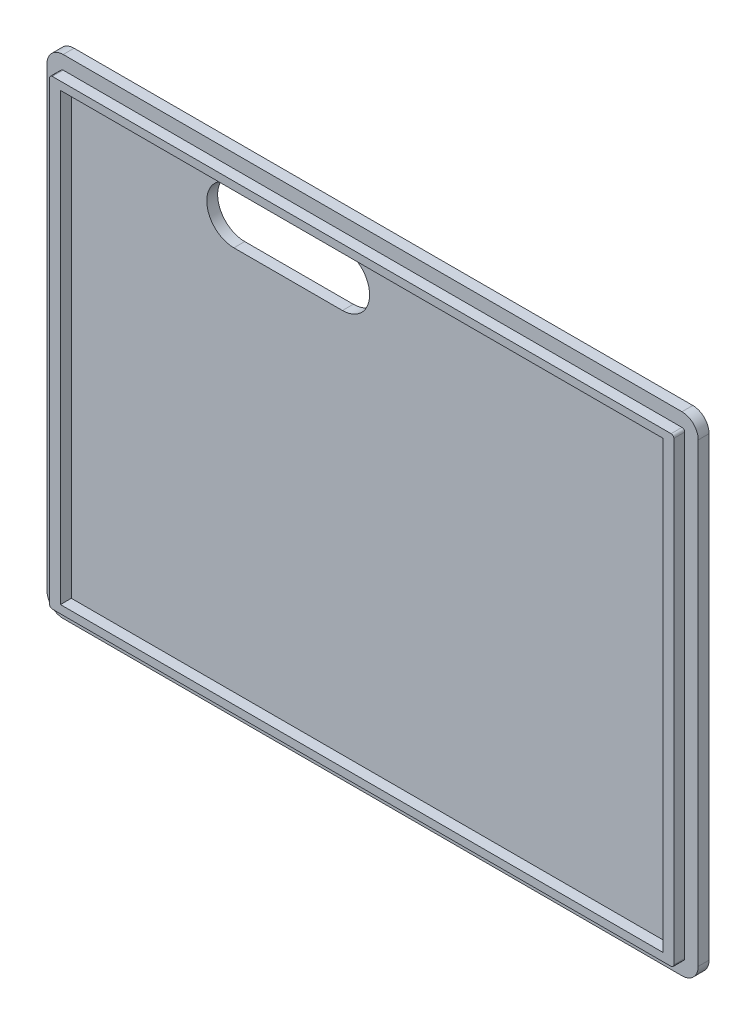
ISO-10303-21;
HEADER;
FILE_DESCRIPTION(('STEP AP214'),'2;1');
FILE_NAME('part.step','',(''),(''),'','','');
FILE_SCHEMA(('AUTOMOTIVE_DESIGN { 1 0 10303 214 1 1 1 1 }'));
ENDSEC;
DATA;
#1=APPLICATION_CONTEXT('core data for automotive mechanical design processes');
#2=APPLICATION_PROTOCOL_DEFINITION('international standard','automotive_design',2000,#1);
#3=PRODUCT_CONTEXT('',#1,'mechanical');
#4=PRODUCT('Part','Part','',(#3));
#5=PRODUCT_RELATED_PRODUCT_CATEGORY('part','',(#4));
#6=PRODUCT_DEFINITION_FORMATION('','',#4);
#7=PRODUCT_DEFINITION_CONTEXT('part definition',#1,'design');
#8=PRODUCT_DEFINITION('design','',#6,#7);
#9=PRODUCT_DEFINITION_SHAPE('','',#8);
#10=(LENGTH_UNIT() NAMED_UNIT(*) SI_UNIT(.MILLI.,.METRE.));
#11=(NAMED_UNIT(*) PLANE_ANGLE_UNIT() SI_UNIT($,.RADIAN.));
#12=(NAMED_UNIT(*) SI_UNIT($,.STERADIAN.) SOLID_ANGLE_UNIT());
#13=UNCERTAINTY_MEASURE_WITH_UNIT(LENGTH_MEASURE(1.E-05),#10,'distance_accuracy_value','');
#14=(GEOMETRIC_REPRESENTATION_CONTEXT(3) GLOBAL_UNCERTAINTY_ASSIGNED_CONTEXT((#13)) GLOBAL_UNIT_ASSIGNED_CONTEXT((#10,
#11,#12)) REPRESENTATION_CONTEXT('',''));
#15=CARTESIAN_POINT('',(0.,0.,0.));
#16=DIRECTION('',(0.,0.,1.));
#17=DIRECTION('',(1.,0.,0.));
#18=AXIS2_PLACEMENT_3D('',#15,#16,#17);
#19=CARTESIAN_POINT('',(0.,0.,2.));
#20=DIRECTION('',(0.,0.,1.));
#21=DIRECTION('',(1.,0.,0.));
#22=AXIS2_PLACEMENT_3D('',#19,#20,#21);
#23=PLANE('',#22);
#24=DIRECTION('',(1.,0.,0.));
#25=VECTOR('',#24,1.);
#26=CARTESIAN_POINT('',(60.,-45.,2.));
#27=LINE('',#26,#25);
#28=CARTESIAN_POINT('',(-57.,-45.,2.));
#29=VERTEX_POINT('',#28);
#30=CARTESIAN_POINT('',(57.,-45.,2.));
#31=VERTEX_POINT('',#30);
#32=EDGE_CURVE('E296',#29,#31,#27,.T.);
#33=ORIENTED_EDGE('',*,*,#32,.T.);
#34=CARTESIAN_POINT('',(57.,-42.,2.));
#35=DIRECTION('',(0.,0.,1.));
#36=DIRECTION('',(1.,0.,0.));
#37=AXIS2_PLACEMENT_3D('',#34,#35,#36);
#38=CIRCLE('',#37,3.);
#39=CARTESIAN_POINT('',(60.,-42.,2.));
#40=VERTEX_POINT('',#39);
#41=EDGE_CURVE('E340',#31,#40,#38,.T.);
#42=ORIENTED_EDGE('',*,*,#41,.T.);
#43=DIRECTION('',(0.,1.,0.));
#44=VECTOR('',#43,1.);
#45=CARTESIAN_POINT('',(60.,-45.,2.));
#46=LINE('',#45,#44);
#47=CARTESIAN_POINT('',(60.,42.,2.));
#48=VERTEX_POINT('',#47);
#49=EDGE_CURVE('E300',#40,#48,#46,.T.);
#50=ORIENTED_EDGE('',*,*,#49,.T.);
#51=CARTESIAN_POINT('',(57.,42.,2.));
#52=DIRECTION('',(0.,0.,1.));
#53=DIRECTION('',(1.,0.,0.));
#54=AXIS2_PLACEMENT_3D('',#51,#52,#53);
#55=CIRCLE('',#54,3.);
#56=CARTESIAN_POINT('',(57.,45.,2.));
#57=VERTEX_POINT('',#56);
#58=EDGE_CURVE('E338',#48,#57,#55,.T.);
#59=ORIENTED_EDGE('',*,*,#58,.T.);
#60=DIRECTION('',(-1.,0.,0.));
#61=VECTOR('',#60,1.);
#62=CARTESIAN_POINT('',(60.,45.,2.));
#63=LINE('',#62,#61);
#64=CARTESIAN_POINT('',(-57.,45.,2.));
#65=VERTEX_POINT('',#64);
#66=EDGE_CURVE('E303',#57,#65,#63,.T.);
#67=ORIENTED_EDGE('',*,*,#66,.T.);
#68=CARTESIAN_POINT('',(-57.,42.,2.));
#69=DIRECTION('',(0.,0.,1.));
#70=DIRECTION('',(1.,0.,0.));
#71=AXIS2_PLACEMENT_3D('',#68,#69,#70);
#72=CIRCLE('',#71,3.);
#73=CARTESIAN_POINT('',(-60.,42.,2.));
#74=VERTEX_POINT('',#73);
#75=EDGE_CURVE('E334',#65,#74,#72,.T.);
#76=ORIENTED_EDGE('',*,*,#75,.T.);
#77=DIRECTION('',(0.,-1.,0.));
#78=VECTOR('',#77,1.);
#79=CARTESIAN_POINT('',(-60.,-45.,2.));
#80=LINE('',#79,#78);
#81=CARTESIAN_POINT('',(-60.,-42.,2.));
#82=VERTEX_POINT('',#81);
#83=EDGE_CURVE('E293',#74,#82,#80,.T.);
#84=ORIENTED_EDGE('',*,*,#83,.T.);
#85=CARTESIAN_POINT('',(-57.,-42.,2.));
#86=DIRECTION('',(0.,0.,1.));
#87=DIRECTION('',(1.,0.,0.));
#88=AXIS2_PLACEMENT_3D('',#85,#86,#87);
#89=CIRCLE('',#88,3.);
#90=EDGE_CURVE('E336',#82,#29,#89,.T.);
#91=ORIENTED_EDGE('',*,*,#90,.T.);
#92=EDGE_LOOP('',(#33,#42,#50,#59,#67,#76,#84,#91));
#93=FACE_BOUND('',#92,.T.);
#94=DIRECTION('',(1.,0.,0.));
#95=VECTOR('',#94,1.);
#96=CARTESIAN_POINT('',(57.5,-42.5,2.));
#97=LINE('',#96,#95);
#98=CARTESIAN_POINT('',(-57.,-42.5,2.));
#99=VERTEX_POINT('',#98);
#100=CARTESIAN_POINT('',(57.,-42.5,2.));
#101=VERTEX_POINT('',#100);
#102=EDGE_CURVE('E285',#99,#101,#97,.T.);
#103=ORIENTED_EDGE('',*,*,#102,.F.);
#104=CARTESIAN_POINT('',(-57.,-42.,2.));
#105=DIRECTION('',(0.,0.,1.));
#106=DIRECTION('',(1.,0.,0.));
#107=AXIS2_PLACEMENT_3D('',#104,#105,#106);
#108=CIRCLE('',#107,0.5);
#109=CARTESIAN_POINT('',(-57.5,-42.,2.));
#110=VERTEX_POINT('',#109);
#111=EDGE_CURVE('E11',#99,#110,#108,.F.);
#112=ORIENTED_EDGE('',*,*,#111,.T.);
#113=DIRECTION('',(0.,-1.,0.));
#114=VECTOR('',#113,1.);
#115=CARTESIAN_POINT('',(-57.5,-42.5,2.));
#116=LINE('',#115,#114);
#117=CARTESIAN_POINT('',(-57.5,42.,2.));
#118=VERTEX_POINT('',#117);
#119=EDGE_CURVE('E269',#118,#110,#116,.T.);
#120=ORIENTED_EDGE('',*,*,#119,.F.);
#121=CARTESIAN_POINT('',(-57.,42.,2.));
#122=DIRECTION('',(0.,0.,1.));
#123=DIRECTION('',(1.,0.,0.));
#124=AXIS2_PLACEMENT_3D('',#121,#122,#123);
#125=CIRCLE('',#124,0.5);
#126=CARTESIAN_POINT('',(-57.,42.5,2.));
#127=VERTEX_POINT('',#126);
#128=EDGE_CURVE('E45',#118,#127,#125,.F.);
#129=ORIENTED_EDGE('',*,*,#128,.T.);
#130=DIRECTION('',(-1.,0.,0.));
#131=VECTOR('',#130,1.);
#132=CARTESIAN_POINT('',(57.5,42.5,2.));
#133=LINE('',#132,#131);
#134=CARTESIAN_POINT('',(57.,42.5,2.));
#135=VERTEX_POINT('',#134);
#136=EDGE_CURVE('E274',#135,#127,#133,.T.);
#137=ORIENTED_EDGE('',*,*,#136,.F.);
#138=CARTESIAN_POINT('',(57.,42.,2.));
#139=DIRECTION('',(0.,0.,1.));
#140=DIRECTION('',(1.,0.,0.));
#141=AXIS2_PLACEMENT_3D('',#138,#139,#140);
#142=CIRCLE('',#141,0.5);
#143=CARTESIAN_POINT('',(57.5,42.,2.));
#144=VERTEX_POINT('',#143);
#145=EDGE_CURVE('E381',#135,#144,#142,.F.);
#146=ORIENTED_EDGE('',*,*,#145,.T.);
#147=DIRECTION('',(0.,1.,0.));
#148=VECTOR('',#147,1.);
#149=CARTESIAN_POINT('',(57.5,-42.5,2.));
#150=LINE('',#149,#148);
#151=CARTESIAN_POINT('',(57.5,-42.,2.));
#152=VERTEX_POINT('',#151);
#153=EDGE_CURVE('E288',#152,#144,#150,.T.);
#154=ORIENTED_EDGE('',*,*,#153,.F.);
#155=CARTESIAN_POINT('',(57.,-42.,2.));
#156=DIRECTION('',(0.,0.,1.));
#157=DIRECTION('',(1.,0.,0.));
#158=AXIS2_PLACEMENT_3D('',#155,#156,#157);
#159=CIRCLE('',#158,0.5);
#160=EDGE_CURVE('E379',#152,#101,#159,.F.);
#161=ORIENTED_EDGE('',*,*,#160,.T.);
#162=EDGE_LOOP('',(#103,#112,#120,#129,#137,#146,#154,#161));
#163=FACE_BOUND('',#162,.T.);
#164=ADVANCED_FACE('F37',(#93,#163),#23,.T.);
#165=CARTESIAN_POINT('',(-60.,-45.,2.));
#166=DIRECTION('',(1.,0.,0.));
#167=DIRECTION('',(0.,0.,-1.));
#168=AXIS2_PLACEMENT_3D('',#165,#166,#167);
#169=PLANE('',#168);
#170=DIRECTION('',(0.,-1.,0.));
#171=VECTOR('',#170,1.);
#172=CARTESIAN_POINT('',(-60.,-45.,0.));
#173=LINE('',#172,#171);
#174=CARTESIAN_POINT('',(-60.,42.,0.));
#175=VERTEX_POINT('',#174);
#176=CARTESIAN_POINT('',(-60.,-42.,0.));
#177=VERTEX_POINT('',#176);
#178=EDGE_CURVE('E283',#175,#177,#173,.T.);
#179=ORIENTED_EDGE('',*,*,#178,.T.);
#180=DIRECTION('',(0.,0.,-1.));
#181=VECTOR('',#180,1.);
#182=CARTESIAN_POINT('',(-60.,-42.,2.));
#183=LINE('',#182,#181);
#184=EDGE_CURVE('E350',#177,#82,#183,.F.);
#185=ORIENTED_EDGE('',*,*,#184,.T.);
#186=ORIENTED_EDGE('',*,*,#83,.F.);
#187=DIRECTION('',(0.,0.,-1.));
#188=VECTOR('',#187,1.);
#189=CARTESIAN_POINT('',(-60.,42.,2.));
#190=LINE('',#189,#188);
#191=EDGE_CURVE('E347',#74,#175,#190,.T.);
#192=ORIENTED_EDGE('',*,*,#191,.T.);
#193=EDGE_LOOP('',(#179,#185,#186,#192));
#194=FACE_BOUND('',#193,.T.);
#195=ADVANCED_FACE('F424',(#194),#169,.F.);
#196=CARTESIAN_POINT('',(60.,-45.,2.));
#197=DIRECTION('',(0.,1.,0.));
#198=DIRECTION('',(-1.,0.,0.));
#199=AXIS2_PLACEMENT_3D('',#196,#197,#198);
#200=PLANE('',#199);
#201=DIRECTION('',(1.,0.,0.));
#202=VECTOR('',#201,1.);
#203=CARTESIAN_POINT('',(60.,-45.,0.));
#204=LINE('',#203,#202);
#205=CARTESIAN_POINT('',(-57.,-45.,0.));
#206=VERTEX_POINT('',#205);
#207=CARTESIAN_POINT('',(57.,-45.,0.));
#208=VERTEX_POINT('',#207);
#209=EDGE_CURVE('E309',#206,#208,#204,.T.);
#210=ORIENTED_EDGE('',*,*,#209,.T.);
#211=DIRECTION('',(0.,0.,-1.));
#212=VECTOR('',#211,1.);
#213=CARTESIAN_POINT('',(57.,-45.,2.));
#214=LINE('',#213,#212);
#215=EDGE_CURVE('E332',#208,#31,#214,.F.);
#216=ORIENTED_EDGE('',*,*,#215,.T.);
#217=ORIENTED_EDGE('',*,*,#32,.F.);
#218=DIRECTION('',(0.,0.,-1.));
#219=VECTOR('',#218,1.);
#220=CARTESIAN_POINT('',(-57.,-45.,2.));
#221=LINE('',#220,#219);
#222=EDGE_CURVE('E329',#29,#206,#221,.T.);
#223=ORIENTED_EDGE('',*,*,#222,.T.);
#224=EDGE_LOOP('',(#210,#216,#217,#223));
#225=FACE_BOUND('',#224,.T.);
#226=ADVANCED_FACE('F430',(#225),#200,.F.);
#227=CARTESIAN_POINT('',(60.,-45.,2.));
#228=DIRECTION('',(-1.,0.,0.));
#229=DIRECTION('',(0.,0.,1.));
#230=AXIS2_PLACEMENT_3D('',#227,#228,#229);
#231=PLANE('',#230);
#232=ORIENTED_EDGE('',*,*,#49,.F.);
#233=DIRECTION('',(0.,0.,-1.));
#234=VECTOR('',#233,1.);
#235=CARTESIAN_POINT('',(60.,-42.,2.));
#236=LINE('',#235,#234);
#237=CARTESIAN_POINT('',(60.,-42.,0.));
#238=VERTEX_POINT('',#237);
#239=EDGE_CURVE('E318',#40,#238,#236,.T.);
#240=ORIENTED_EDGE('',*,*,#239,.T.);
#241=DIRECTION('',(0.,1.,0.));
#242=VECTOR('',#241,1.);
#243=CARTESIAN_POINT('',(60.,-45.,0.));
#244=LINE('',#243,#242);
#245=CARTESIAN_POINT('',(60.,42.,0.));
#246=VERTEX_POINT('',#245);
#247=EDGE_CURVE('E312',#238,#246,#244,.T.);
#248=ORIENTED_EDGE('',*,*,#247,.T.);
#249=DIRECTION('',(0.,0.,-1.));
#250=VECTOR('',#249,1.);
#251=CARTESIAN_POINT('',(60.,42.,2.));
#252=LINE('',#251,#250);
#253=EDGE_CURVE('E306',#246,#48,#252,.F.);
#254=ORIENTED_EDGE('',*,*,#253,.T.);
#255=EDGE_LOOP('',(#232,#240,#248,#254));
#256=FACE_BOUND('',#255,.T.);
#257=ADVANCED_FACE('F561',(#256),#231,.F.);
#258=CARTESIAN_POINT('',(60.,45.,2.));
#259=DIRECTION('',(0.,-1.,0.));
#260=DIRECTION('',(1.,0.,0.));
#261=AXIS2_PLACEMENT_3D('',#258,#259,#260);
#262=PLANE('',#261);
#263=ORIENTED_EDGE('',*,*,#66,.F.);
#264=DIRECTION('',(0.,0.,-1.));
#265=VECTOR('',#264,1.);
#266=CARTESIAN_POINT('',(57.,45.,2.));
#267=LINE('',#266,#265);
#268=CARTESIAN_POINT('',(57.,45.,0.));
#269=VERTEX_POINT('',#268);
#270=EDGE_CURVE('E344',#57,#269,#267,.T.);
#271=ORIENTED_EDGE('',*,*,#270,.T.);
#272=DIRECTION('',(-1.,0.,0.));
#273=VECTOR('',#272,1.);
#274=CARTESIAN_POINT('',(60.,45.,0.));
#275=LINE('',#274,#273);
#276=CARTESIAN_POINT('',(-57.,45.,0.));
#277=VERTEX_POINT('',#276);
#278=EDGE_CURVE('E297',#269,#277,#275,.T.);
#279=ORIENTED_EDGE('',*,*,#278,.T.);
#280=DIRECTION('',(0.,0.,-1.));
#281=VECTOR('',#280,1.);
#282=CARTESIAN_POINT('',(-57.,45.,2.));
#283=LINE('',#282,#281);
#284=EDGE_CURVE('E342',#277,#65,#283,.F.);
#285=ORIENTED_EDGE('',*,*,#284,.T.);
#286=EDGE_LOOP('',(#263,#271,#279,#285));
#287=FACE_BOUND('',#286,.T.);
#288=ADVANCED_FACE('F571',(#287),#262,.F.);
#289=CARTESIAN_POINT('',(0.,0.,0.));
#290=DIRECTION('',(0.,0.,1.));
#291=DIRECTION('',(1.,0.,0.));
#292=AXIS2_PLACEMENT_3D('',#289,#290,#291);
#293=PLANE('',#292);
#294=DIRECTION('',(-1.,0.,0.));
#295=VECTOR('',#294,1.);
#296=CARTESIAN_POINT('',(-5.54838070688902,29.8749582438508,0.));
#297=LINE('',#296,#295);
#298=CARTESIAN_POINT('',(-5.54838070688902,29.8749582438508,0.));
#299=VERTEX_POINT('',#298);
#300=CARTESIAN_POINT('',(-25.548380706889,29.8749582438508,0.));
#301=VERTEX_POINT('',#300);
#302=EDGE_CURVE('E231',#299,#301,#297,.T.);
#303=ORIENTED_EDGE('',*,*,#302,.F.);
#304=CARTESIAN_POINT('',(-5.54838070688902,34.8749582438508,0.));
#305=DIRECTION('',(0.,0.,-1.));
#306=DIRECTION('',(-1.,0.,0.));
#307=AXIS2_PLACEMENT_3D('',#304,#305,#306);
#308=CIRCLE('',#307,5.);
#309=CARTESIAN_POINT('',(-5.54838070688902,39.8749582438508,0.));
#310=VERTEX_POINT('',#309);
#311=EDGE_CURVE('E204',#310,#299,#308,.T.);
#312=ORIENTED_EDGE('',*,*,#311,.F.);
#313=DIRECTION('',(1.,0.,0.));
#314=VECTOR('',#313,1.);
#315=CARTESIAN_POINT('',(-5.54838070688902,39.8749582438508,0.));
#316=LINE('',#315,#314);
#317=CARTESIAN_POINT('',(-25.548380706889,39.8749582438508,0.));
#318=VERTEX_POINT('',#317);
#319=EDGE_CURVE('E222',#318,#310,#316,.T.);
#320=ORIENTED_EDGE('',*,*,#319,.F.);
#321=CARTESIAN_POINT('',(-25.548380706889,34.8749582438508,0.));
#322=DIRECTION('',(0.,0.,-1.));
#323=DIRECTION('',(-1.,0.,0.));
#324=AXIS2_PLACEMENT_3D('',#321,#322,#323);
#325=CIRCLE('',#324,5.);
#326=EDGE_CURVE('E225',#301,#318,#325,.T.);
#327=ORIENTED_EDGE('',*,*,#326,.F.);
#328=EDGE_LOOP('',(#303,#312,#320,#327));
#329=FACE_BOUND('',#328,.T.);
#330=ORIENTED_EDGE('',*,*,#247,.F.);
#331=CARTESIAN_POINT('',(57.,-42.,0.));
#332=DIRECTION('',(0.,0.,1.));
#333=DIRECTION('',(1.,0.,0.));
#334=AXIS2_PLACEMENT_3D('',#331,#332,#333);
#335=CIRCLE('',#334,3.);
#336=EDGE_CURVE('E327',#238,#208,#335,.F.);
#337=ORIENTED_EDGE('',*,*,#336,.T.);
#338=ORIENTED_EDGE('',*,*,#209,.F.);
#339=CARTESIAN_POINT('',(-57.,-42.,0.));
#340=DIRECTION('',(0.,0.,1.));
#341=DIRECTION('',(1.,0.,0.));
#342=AXIS2_PLACEMENT_3D('',#339,#340,#341);
#343=CIRCLE('',#342,3.);
#344=EDGE_CURVE('E323',#206,#177,#343,.F.);
#345=ORIENTED_EDGE('',*,*,#344,.T.);
#346=ORIENTED_EDGE('',*,*,#178,.F.);
#347=CARTESIAN_POINT('',(-57.,42.,0.));
#348=DIRECTION('',(0.,0.,1.));
#349=DIRECTION('',(1.,0.,0.));
#350=AXIS2_PLACEMENT_3D('',#347,#348,#349);
#351=CIRCLE('',#350,3.);
#352=EDGE_CURVE('E321',#175,#277,#351,.F.);
#353=ORIENTED_EDGE('',*,*,#352,.T.);
#354=ORIENTED_EDGE('',*,*,#278,.F.);
#355=CARTESIAN_POINT('',(57.,42.,0.));
#356=DIRECTION('',(0.,0.,1.));
#357=DIRECTION('',(1.,0.,0.));
#358=AXIS2_PLACEMENT_3D('',#355,#356,#357);
#359=CIRCLE('',#358,3.);
#360=EDGE_CURVE('E325',#269,#246,#359,.F.);
#361=ORIENTED_EDGE('',*,*,#360,.T.);
#362=EDGE_LOOP('',(#330,#337,#338,#345,#346,#353,#354,#361));
#363=FACE_BOUND('',#362,.T.);
#364=ADVANCED_FACE('F464',(#329,#363),#293,.F.);
#365=CARTESIAN_POINT('',(0.,0.,4.));
#366=DIRECTION('',(0.,0.,1.));
#367=DIRECTION('',(1.,0.,0.));
#368=AXIS2_PLACEMENT_3D('',#365,#366,#367);
#369=PLANE('',#368);
#370=DIRECTION('',(1.,0.,0.));
#371=VECTOR('',#370,1.);
#372=CARTESIAN_POINT('',(57.5,-42.5,4.));
#373=LINE('',#372,#371);
#374=CARTESIAN_POINT('',(-57.,-42.5,4.));
#375=VERTEX_POINT('',#374);
#376=CARTESIAN_POINT('',(57.,-42.5,4.));
#377=VERTEX_POINT('',#376);
#378=EDGE_CURVE('E273',#375,#377,#373,.T.);
#379=ORIENTED_EDGE('',*,*,#378,.T.);
#380=CARTESIAN_POINT('',(57.,-42.,4.));
#381=DIRECTION('',(0.,0.,1.));
#382=DIRECTION('',(1.,0.,0.));
#383=AXIS2_PLACEMENT_3D('',#380,#381,#382);
#384=CIRCLE('',#383,0.5);
#385=CARTESIAN_POINT('',(57.5,-42.,4.));
#386=VERTEX_POINT('',#385);
#387=EDGE_CURVE('E368',#377,#386,#384,.T.);
#388=ORIENTED_EDGE('',*,*,#387,.T.);
#389=DIRECTION('',(0.,1.,0.));
#390=VECTOR('',#389,1.);
#391=CARTESIAN_POINT('',(57.5,-42.5,4.));
#392=LINE('',#391,#390);
#393=CARTESIAN_POINT('',(57.5,42.,4.));
#394=VERTEX_POINT('',#393);
#395=EDGE_CURVE('E277',#386,#394,#392,.T.);
#396=ORIENTED_EDGE('',*,*,#395,.T.);
#397=CARTESIAN_POINT('',(57.,42.,4.));
#398=DIRECTION('',(0.,0.,1.));
#399=DIRECTION('',(1.,0.,0.));
#400=AXIS2_PLACEMENT_3D('',#397,#398,#399);
#401=CIRCLE('',#400,0.5);
#402=CARTESIAN_POINT('',(57.,42.5,4.));
#403=VERTEX_POINT('',#402);
#404=EDGE_CURVE('E366',#394,#403,#401,.T.);
#405=ORIENTED_EDGE('',*,*,#404,.T.);
#406=DIRECTION('',(-1.,0.,0.));
#407=VECTOR('',#406,1.);
#408=CARTESIAN_POINT('',(57.5,42.5,4.));
#409=LINE('',#408,#407);
#410=CARTESIAN_POINT('',(-57.,42.5,4.));
#411=VERTEX_POINT('',#410);
#412=EDGE_CURVE('E280',#403,#411,#409,.T.);
#413=ORIENTED_EDGE('',*,*,#412,.T.);
#414=CARTESIAN_POINT('',(-57.,42.,4.));
#415=DIRECTION('',(0.,0.,1.));
#416=DIRECTION('',(1.,0.,0.));
#417=AXIS2_PLACEMENT_3D('',#414,#415,#416);
#418=CIRCLE('',#417,0.5);
#419=CARTESIAN_POINT('',(-57.5,42.,4.));
#420=VERTEX_POINT('',#419);
#421=EDGE_CURVE('E364',#411,#420,#418,.T.);
#422=ORIENTED_EDGE('',*,*,#421,.T.);
#423=DIRECTION('',(0.,-1.,0.));
#424=VECTOR('',#423,1.);
#425=CARTESIAN_POINT('',(-57.5,-42.5,4.));
#426=LINE('',#425,#424);
#427=CARTESIAN_POINT('',(-57.5,-42.,4.));
#428=VERTEX_POINT('',#427);
#429=EDGE_CURVE('E270',#420,#428,#426,.T.);
#430=ORIENTED_EDGE('',*,*,#429,.T.);
#431=CARTESIAN_POINT('',(-57.,-42.,4.));
#432=DIRECTION('',(0.,0.,1.));
#433=DIRECTION('',(1.,0.,0.));
#434=AXIS2_PLACEMENT_3D('',#431,#432,#433);
#435=CIRCLE('',#434,0.5);
#436=EDGE_CURVE('E362',#428,#375,#435,.T.);
#437=ORIENTED_EDGE('',*,*,#436,.T.);
#438=EDGE_LOOP('',(#379,#388,#396,#405,#413,#422,#430,#437));
#439=FACE_BOUND('',#438,.T.);
#440=DIRECTION('',(1.,0.,0.));
#441=VECTOR('',#440,1.);
#442=CARTESIAN_POINT('',(55.5,-41.0217391304348,4.));
#443=LINE('',#442,#441);
#444=CARTESIAN_POINT('',(-55.5,-41.0217391304348,4.));
#445=VERTEX_POINT('',#444);
#446=CARTESIAN_POINT('',(55.5,-41.0217391304348,4.));
#447=VERTEX_POINT('',#446);
#448=EDGE_CURVE('E243',#445,#447,#443,.T.);
#449=ORIENTED_EDGE('',*,*,#448,.F.);
#450=DIRECTION('',(0.,-1.,0.));
#451=VECTOR('',#450,1.);
#452=CARTESIAN_POINT('',(-55.5,-41.0217391304348,4.));
#453=LINE('',#452,#451);
#454=CARTESIAN_POINT('',(-55.5,41.0217391304348,4.));
#455=VERTEX_POINT('',#454);
#456=EDGE_CURVE('E241',#455,#445,#453,.T.);
#457=ORIENTED_EDGE('',*,*,#456,.F.);
#458=DIRECTION('',(-1.,0.,0.));
#459=VECTOR('',#458,1.);
#460=CARTESIAN_POINT('',(55.5,41.0217391304348,4.));
#461=LINE('',#460,#459);
#462=CARTESIAN_POINT('',(55.5,41.0217391304348,4.));
#463=VERTEX_POINT('',#462);
#464=EDGE_CURVE('E249',#463,#455,#461,.T.);
#465=ORIENTED_EDGE('',*,*,#464,.F.);
#466=DIRECTION('',(0.,1.,0.));
#467=VECTOR('',#466,1.);
#468=CARTESIAN_POINT('',(55.5,-41.0217391304348,4.));
#469=LINE('',#468,#467);
#470=EDGE_CURVE('E246',#447,#463,#469,.T.);
#471=ORIENTED_EDGE('',*,*,#470,.F.);
#472=EDGE_LOOP('',(#449,#457,#465,#471));
#473=FACE_BOUND('',#472,.T.);
#474=ADVANCED_FACE('F391',(#439,#473),#369,.T.);
#475=CARTESIAN_POINT('',(-57.5,-42.5,4.));
#476=DIRECTION('',(1.,0.,0.));
#477=DIRECTION('',(0.,0.,-1.));
#478=AXIS2_PLACEMENT_3D('',#475,#476,#477);
#479=PLANE('',#478);
#480=ORIENTED_EDGE('',*,*,#429,.F.);
#481=DIRECTION('',(0.,0.,-1.));
#482=VECTOR('',#481,1.);
#483=CARTESIAN_POINT('',(-57.5,42.,4.));
#484=LINE('',#483,#482);
#485=EDGE_CURVE('E377',#420,#118,#484,.T.);
#486=ORIENTED_EDGE('',*,*,#485,.T.);
#487=ORIENTED_EDGE('',*,*,#119,.T.);
#488=DIRECTION('',(0.,0.,-1.));
#489=VECTOR('',#488,1.);
#490=CARTESIAN_POINT('',(-57.5,-42.,4.));
#491=LINE('',#490,#489);
#492=EDGE_CURVE('E375',#110,#428,#491,.F.);
#493=ORIENTED_EDGE('',*,*,#492,.T.);
#494=EDGE_LOOP('',(#480,#486,#487,#493));
#495=FACE_BOUND('',#494,.T.);
#496=ADVANCED_FACE('F395',(#495),#479,.F.);
#497=CARTESIAN_POINT('',(57.5,-42.5,4.));
#498=DIRECTION('',(0.,1.,0.));
#499=DIRECTION('',(0.,0.,1.));
#500=AXIS2_PLACEMENT_3D('',#497,#498,#499);
#501=PLANE('',#500);
#502=ORIENTED_EDGE('',*,*,#102,.T.);
#503=DIRECTION('',(0.,0.,-1.));
#504=VECTOR('',#503,1.);
#505=CARTESIAN_POINT('',(57.,-42.5,4.));
#506=LINE('',#505,#504);
#507=EDGE_CURVE('E360',#101,#377,#506,.F.);
#508=ORIENTED_EDGE('',*,*,#507,.T.);
#509=ORIENTED_EDGE('',*,*,#378,.F.);
#510=DIRECTION('',(0.,0.,-1.));
#511=VECTOR('',#510,1.);
#512=CARTESIAN_POINT('',(-57.,-42.5,4.));
#513=LINE('',#512,#511);
#514=EDGE_CURVE('E357',#375,#99,#513,.T.);
#515=ORIENTED_EDGE('',*,*,#514,.T.);
#516=EDGE_LOOP('',(#502,#508,#509,#515));
#517=FACE_BOUND('',#516,.T.);
#518=ADVANCED_FACE('F402',(#517),#501,.F.);
#519=CARTESIAN_POINT('',(57.5,-42.5,4.));
#520=DIRECTION('',(-1.,0.,0.));
#521=DIRECTION('',(0.,0.,1.));
#522=AXIS2_PLACEMENT_3D('',#519,#520,#521);
#523=PLANE('',#522);
#524=ORIENTED_EDGE('',*,*,#395,.F.);
#525=DIRECTION('',(0.,0.,-1.));
#526=VECTOR('',#525,1.);
#527=CARTESIAN_POINT('',(57.5,-42.,4.));
#528=LINE('',#527,#526);
#529=EDGE_CURVE('E354',#386,#152,#528,.T.);
#530=ORIENTED_EDGE('',*,*,#529,.T.);
#531=ORIENTED_EDGE('',*,*,#153,.T.);
#532=DIRECTION('',(0.,0.,-1.));
#533=VECTOR('',#532,1.);
#534=CARTESIAN_POINT('',(57.5,42.,4.));
#535=LINE('',#534,#533);
#536=EDGE_CURVE('E352',#144,#394,#535,.F.);
#537=ORIENTED_EDGE('',*,*,#536,.T.);
#538=EDGE_LOOP('',(#524,#530,#531,#537));
#539=FACE_BOUND('',#538,.T.);
#540=ADVANCED_FACE('F410',(#539),#523,.F.);
#541=CARTESIAN_POINT('',(57.5,42.5,4.));
#542=DIRECTION('',(0.,-1.,0.));
#543=DIRECTION('',(0.,0.,-1.));
#544=AXIS2_PLACEMENT_3D('',#541,#542,#543);
#545=PLANE('',#544);
#546=ORIENTED_EDGE('',*,*,#412,.F.);
#547=DIRECTION('',(0.,0.,-1.));
#548=VECTOR('',#547,1.);
#549=CARTESIAN_POINT('',(57.,42.5,4.));
#550=LINE('',#549,#548);
#551=EDGE_CURVE('E372',#403,#135,#550,.T.);
#552=ORIENTED_EDGE('',*,*,#551,.T.);
#553=ORIENTED_EDGE('',*,*,#136,.T.);
#554=DIRECTION('',(0.,0.,-1.));
#555=VECTOR('',#554,1.);
#556=CARTESIAN_POINT('',(-57.,42.5,4.));
#557=LINE('',#556,#555);
#558=EDGE_CURVE('E370',#127,#411,#557,.F.);
#559=ORIENTED_EDGE('',*,*,#558,.T.);
#560=EDGE_LOOP('',(#546,#552,#553,#559));
#561=FACE_BOUND('',#560,.T.);
#562=ADVANCED_FACE('F385',(#561),#545,.F.);
#563=CARTESIAN_POINT('',(-55.5,-41.0217391304348,4.));
#564=DIRECTION('',(1.,0.,0.));
#565=DIRECTION('',(0.,0.,-1.));
#566=AXIS2_PLACEMENT_3D('',#563,#564,#565);
#567=PLANE('',#566);
#568=DIRECTION('',(0.,-1.,0.));
#569=VECTOR('',#568,1.);
#570=CARTESIAN_POINT('',(-55.5,-41.0217391304348,2.));
#571=LINE('',#570,#569);
#572=CARTESIAN_POINT('',(-55.5,41.0217391304348,2.));
#573=VERTEX_POINT('',#572);
#574=CARTESIAN_POINT('',(-55.5,-41.0217391304348,2.));
#575=VERTEX_POINT('',#574);
#576=EDGE_CURVE('E237',#573,#575,#571,.T.);
#577=ORIENTED_EDGE('',*,*,#576,.F.);
#578=DIRECTION('',(0.,0.,-1.));
#579=VECTOR('',#578,1.);
#580=CARTESIAN_POINT('',(-55.5,41.0217391304348,4.));
#581=LINE('',#580,#579);
#582=EDGE_CURVE('E251',#455,#573,#581,.T.);
#583=ORIENTED_EDGE('',*,*,#582,.F.);
#584=ORIENTED_EDGE('',*,*,#456,.T.);
#585=DIRECTION('',(0.,0.,-1.));
#586=VECTOR('',#585,1.);
#587=CARTESIAN_POINT('',(-55.5,-41.0217391304348,4.));
#588=LINE('',#587,#586);
#589=EDGE_CURVE('E266',#445,#575,#588,.T.);
#590=ORIENTED_EDGE('',*,*,#589,.T.);
#591=EDGE_LOOP('',(#577,#583,#584,#590));
#592=FACE_BOUND('',#591,.T.);
#593=ADVANCED_FACE('F457',(#592),#567,.T.);
#594=CARTESIAN_POINT('',(55.5,-41.0217391304348,4.));
#595=DIRECTION('',(0.,1.,0.));
#596=DIRECTION('',(0.,0.,1.));
#597=AXIS2_PLACEMENT_3D('',#594,#595,#596);
#598=PLANE('',#597);
#599=DIRECTION('',(1.,0.,0.));
#600=VECTOR('',#599,1.);
#601=CARTESIAN_POINT('',(55.5,-41.0217391304348,2.));
#602=LINE('',#601,#600);
#603=CARTESIAN_POINT('',(55.5,-41.0217391304348,2.));
#604=VERTEX_POINT('',#603);
#605=EDGE_CURVE('E253',#575,#604,#602,.T.);
#606=ORIENTED_EDGE('',*,*,#605,.F.);
#607=ORIENTED_EDGE('',*,*,#589,.F.);
#608=ORIENTED_EDGE('',*,*,#448,.T.);
#609=DIRECTION('',(0.,0.,-1.));
#610=VECTOR('',#609,1.);
#611=CARTESIAN_POINT('',(55.5,-41.0217391304348,4.));
#612=LINE('',#611,#610);
#613=EDGE_CURVE('E263',#447,#604,#612,.T.);
#614=ORIENTED_EDGE('',*,*,#613,.T.);
#615=EDGE_LOOP('',(#606,#607,#608,#614));
#616=FACE_BOUND('',#615,.T.);
#617=ADVANCED_FACE('F449',(#616),#598,.T.);
#618=CARTESIAN_POINT('',(55.5,-41.0217391304348,4.));
#619=DIRECTION('',(-1.,0.,0.));
#620=DIRECTION('',(0.,0.,1.));
#621=AXIS2_PLACEMENT_3D('',#618,#619,#620);
#622=PLANE('',#621);
#623=DIRECTION('',(0.,1.,0.));
#624=VECTOR('',#623,1.);
#625=CARTESIAN_POINT('',(55.5,-41.0217391304348,2.));
#626=LINE('',#625,#624);
#627=CARTESIAN_POINT('',(55.5,41.0217391304348,2.));
#628=VERTEX_POINT('',#627);
#629=EDGE_CURVE('E255',#604,#628,#626,.T.);
#630=ORIENTED_EDGE('',*,*,#629,.F.);
#631=ORIENTED_EDGE('',*,*,#613,.F.);
#632=ORIENTED_EDGE('',*,*,#470,.T.);
#633=DIRECTION('',(0.,0.,-1.));
#634=VECTOR('',#633,1.);
#635=CARTESIAN_POINT('',(55.5,41.0217391304348,4.));
#636=LINE('',#635,#634);
#637=EDGE_CURVE('E260',#463,#628,#636,.T.);
#638=ORIENTED_EDGE('',*,*,#637,.T.);
#639=EDGE_LOOP('',(#630,#631,#632,#638));
#640=FACE_BOUND('',#639,.T.);
#641=ADVANCED_FACE('F443',(#640),#622,.T.);
#642=CARTESIAN_POINT('',(55.5,41.0217391304348,4.));
#643=DIRECTION('',(0.,-1.,0.));
#644=DIRECTION('',(0.,0.,-1.));
#645=AXIS2_PLACEMENT_3D('',#642,#643,#644);
#646=PLANE('',#645);
#647=DIRECTION('',(-1.,0.,0.));
#648=VECTOR('',#647,1.);
#649=CARTESIAN_POINT('',(55.5,41.0217391304348,2.));
#650=LINE('',#649,#648);
#651=EDGE_CURVE('E244',#628,#573,#650,.T.);
#652=ORIENTED_EDGE('',*,*,#651,.F.);
#653=ORIENTED_EDGE('',*,*,#637,.F.);
#654=ORIENTED_EDGE('',*,*,#464,.T.);
#655=ORIENTED_EDGE('',*,*,#582,.T.);
#656=EDGE_LOOP('',(#652,#653,#654,#655));
#657=FACE_BOUND('',#656,.T.);
#658=ADVANCED_FACE('F436',(#657),#646,.T.);
#659=CARTESIAN_POINT('',(-5.54838070688902,34.8749582438508,2.));
#660=DIRECTION('',(0.,0.,-1.));
#661=DIRECTION('',(-1.,0.,0.));
#662=AXIS2_PLACEMENT_3D('',#659,#660,#661);
#663=CIRCLE('',#662,5.);
#664=CARTESIAN_POINT('',(-5.54838070688902,39.8749582438508,2.));
#665=VERTEX_POINT('',#664);
#666=CARTESIAN_POINT('',(-5.54838070688902,29.8749582438508,2.));
#667=VERTEX_POINT('',#666);
#668=EDGE_CURVE('E201',#665,#667,#663,.T.);
#669=ORIENTED_EDGE('',*,*,#668,.T.);
#670=DIRECTION('',(-1.,0.,0.));
#671=VECTOR('',#670,1.);
#672=CARTESIAN_POINT('',(-5.54838070688902,29.8749582438508,2.));
#673=LINE('',#672,#671);
#674=CARTESIAN_POINT('',(-25.548380706889,29.8749582438508,2.));
#675=VERTEX_POINT('',#674);
#676=EDGE_CURVE('E213',#667,#675,#673,.T.);
#677=ORIENTED_EDGE('',*,*,#676,.T.);
#678=CARTESIAN_POINT('',(-25.548380706889,34.8749582438508,2.));
#679=DIRECTION('',(0.,0.,-1.));
#680=DIRECTION('',(-1.,0.,0.));
#681=AXIS2_PLACEMENT_3D('',#678,#679,#680);
#682=CIRCLE('',#681,5.);
#683=CARTESIAN_POINT('',(-25.548380706889,39.8749582438508,2.));
#684=VERTEX_POINT('',#683);
#685=EDGE_CURVE('E217',#675,#684,#682,.T.);
#686=ORIENTED_EDGE('',*,*,#685,.T.);
#687=DIRECTION('',(1.,0.,0.));
#688=VECTOR('',#687,1.);
#689=CARTESIAN_POINT('',(-5.54838070688902,39.8749582438508,2.));
#690=LINE('',#689,#688);
#691=EDGE_CURVE('E209',#684,#665,#690,.T.);
#692=ORIENTED_EDGE('',*,*,#691,.T.);
#693=EDGE_LOOP('',(#669,#677,#686,#692));
#694=FACE_BOUND('',#693,.T.);
#695=ORIENTED_EDGE('',*,*,#576,.T.);
#696=ORIENTED_EDGE('',*,*,#605,.T.);
#697=ORIENTED_EDGE('',*,*,#629,.T.);
#698=ORIENTED_EDGE('',*,*,#651,.T.);
#699=EDGE_LOOP('',(#695,#696,#697,#698));
#700=FACE_BOUND('',#699,.T.);
#701=ADVANCED_FACE('F219',(#694,#700),#23,.T.);
#702=CARTESIAN_POINT('',(-5.54838070688902,34.8749582438508,2.));
#703=DIRECTION('',(0.,0.,-1.));
#704=DIRECTION('',(-1.,0.,0.));
#705=AXIS2_PLACEMENT_3D('',#702,#703,#704);
#706=CYLINDRICAL_SURFACE('',#705,5.);
#707=ORIENTED_EDGE('',*,*,#311,.T.);
#708=DIRECTION('',(0.,0.,-1.));
#709=VECTOR('',#708,1.);
#710=CARTESIAN_POINT('',(-5.54838070688902,29.8749582438508,2.));
#711=LINE('',#710,#709);
#712=EDGE_CURVE('E197',#667,#299,#711,.T.);
#713=ORIENTED_EDGE('',*,*,#712,.F.);
#714=ORIENTED_EDGE('',*,*,#668,.F.);
#715=DIRECTION('',(0.,0.,-1.));
#716=VECTOR('',#715,1.);
#717=CARTESIAN_POINT('',(-5.54838070688902,39.8749582438508,2.));
#718=LINE('',#717,#716);
#719=EDGE_CURVE('E235',#665,#310,#718,.T.);
#720=ORIENTED_EDGE('',*,*,#719,.T.);
#721=EDGE_LOOP('',(#707,#713,#714,#720));
#722=FACE_BOUND('',#721,.T.);
#723=ADVANCED_FACE('F199',(#722),#706,.F.);
#724=CARTESIAN_POINT('',(-5.54838070688902,39.8749582438508,2.));
#725=DIRECTION('',(0.,1.,0.));
#726=DIRECTION('',(-1.,0.,0.));
#727=AXIS2_PLACEMENT_3D('',#724,#725,#726);
#728=PLANE('',#727);
#729=ORIENTED_EDGE('',*,*,#319,.T.);
#730=ORIENTED_EDGE('',*,*,#719,.F.);
#731=ORIENTED_EDGE('',*,*,#691,.F.);
#732=DIRECTION('',(0.,0.,-1.));
#733=VECTOR('',#732,1.);
#734=CARTESIAN_POINT('',(-25.548380706889,39.8749582438508,2.));
#735=LINE('',#734,#733);
#736=EDGE_CURVE('E238',#684,#318,#735,.T.);
#737=ORIENTED_EDGE('',*,*,#736,.T.);
#738=EDGE_LOOP('',(#729,#730,#731,#737));
#739=FACE_BOUND('',#738,.T.);
#740=ADVANCED_FACE('F441',(#739),#728,.F.);
#741=CARTESIAN_POINT('',(-25.548380706889,34.8749582438508,2.));
#742=DIRECTION('',(0.,0.,-1.));
#743=DIRECTION('',(-1.,0.,0.));
#744=AXIS2_PLACEMENT_3D('',#741,#742,#743);
#745=CYLINDRICAL_SURFACE('',#744,5.);
#746=ORIENTED_EDGE('',*,*,#326,.T.);
#747=ORIENTED_EDGE('',*,*,#736,.F.);
#748=ORIENTED_EDGE('',*,*,#685,.F.);
#749=DIRECTION('',(0.,0.,-1.));
#750=VECTOR('',#749,1.);
#751=CARTESIAN_POINT('',(-25.548380706889,29.8749582438508,2.));
#752=LINE('',#751,#750);
#753=EDGE_CURVE('E208',#675,#301,#752,.T.);
#754=ORIENTED_EDGE('',*,*,#753,.T.);
#755=EDGE_LOOP('',(#746,#747,#748,#754));
#756=FACE_BOUND('',#755,.T.);
#757=ADVANCED_FACE('F526',(#756),#745,.F.);
#758=CARTESIAN_POINT('',(-5.54838070688902,29.8749582438508,2.));
#759=DIRECTION('',(0.,-1.,0.));
#760=DIRECTION('',(1.,0.,0.));
#761=AXIS2_PLACEMENT_3D('',#758,#759,#760);
#762=PLANE('',#761);
#763=ORIENTED_EDGE('',*,*,#302,.T.);
#764=ORIENTED_EDGE('',*,*,#753,.F.);
#765=ORIENTED_EDGE('',*,*,#676,.F.);
#766=ORIENTED_EDGE('',*,*,#712,.T.);
#767=EDGE_LOOP('',(#763,#764,#765,#766));
#768=FACE_BOUND('',#767,.T.);
#769=ADVANCED_FACE('F214',(#768),#762,.F.);
#770=CARTESIAN_POINT('',(57.,-42.,2.));
#771=DIRECTION('',(0.,0.,-1.));
#772=DIRECTION('',(-1.,0.,0.));
#773=AXIS2_PLACEMENT_3D('',#770,#771,#772);
#774=CYLINDRICAL_SURFACE('',#773,3.);
#775=ORIENTED_EDGE('',*,*,#41,.F.);
#776=ORIENTED_EDGE('',*,*,#215,.F.);
#777=ORIENTED_EDGE('',*,*,#336,.F.);
#778=ORIENTED_EDGE('',*,*,#239,.F.);
#779=EDGE_LOOP('',(#775,#776,#777,#778));
#780=FACE_BOUND('',#779,.T.);
#781=ADVANCED_FACE('F545',(#780),#774,.T.);
#782=CARTESIAN_POINT('',(57.,42.,2.));
#783=DIRECTION('',(0.,0.,-1.));
#784=DIRECTION('',(-1.,0.,0.));
#785=AXIS2_PLACEMENT_3D('',#782,#783,#784);
#786=CYLINDRICAL_SURFACE('',#785,3.);
#787=ORIENTED_EDGE('',*,*,#58,.F.);
#788=ORIENTED_EDGE('',*,*,#253,.F.);
#789=ORIENTED_EDGE('',*,*,#360,.F.);
#790=ORIENTED_EDGE('',*,*,#270,.F.);
#791=EDGE_LOOP('',(#787,#788,#789,#790));
#792=FACE_BOUND('',#791,.T.);
#793=ADVANCED_FACE('F594',(#792),#786,.T.);
#794=CARTESIAN_POINT('',(-57.,-42.,2.));
#795=DIRECTION('',(0.,0.,-1.));
#796=DIRECTION('',(-1.,0.,0.));
#797=AXIS2_PLACEMENT_3D('',#794,#795,#796);
#798=CYLINDRICAL_SURFACE('',#797,3.);
#799=ORIENTED_EDGE('',*,*,#90,.F.);
#800=ORIENTED_EDGE('',*,*,#184,.F.);
#801=ORIENTED_EDGE('',*,*,#344,.F.);
#802=ORIENTED_EDGE('',*,*,#222,.F.);
#803=EDGE_LOOP('',(#799,#800,#801,#802));
#804=FACE_BOUND('',#803,.T.);
#805=ADVANCED_FACE('F604',(#804),#798,.T.);
#806=CARTESIAN_POINT('',(-57.,42.,2.));
#807=DIRECTION('',(0.,0.,-1.));
#808=DIRECTION('',(-1.,0.,0.));
#809=AXIS2_PLACEMENT_3D('',#806,#807,#808);
#810=CYLINDRICAL_SURFACE('',#809,3.);
#811=ORIENTED_EDGE('',*,*,#75,.F.);
#812=ORIENTED_EDGE('',*,*,#284,.F.);
#813=ORIENTED_EDGE('',*,*,#352,.F.);
#814=ORIENTED_EDGE('',*,*,#191,.F.);
#815=EDGE_LOOP('',(#811,#812,#813,#814));
#816=FACE_BOUND('',#815,.T.);
#817=ADVANCED_FACE('F421',(#816),#810,.T.);
#818=CARTESIAN_POINT('',(57.,-42.,4.));
#819=DIRECTION('',(0.,0.,-1.));
#820=DIRECTION('',(-1.,0.,0.));
#821=AXIS2_PLACEMENT_3D('',#818,#819,#820);
#822=CYLINDRICAL_SURFACE('',#821,0.5);
#823=ORIENTED_EDGE('',*,*,#387,.F.);
#824=ORIENTED_EDGE('',*,*,#507,.F.);
#825=ORIENTED_EDGE('',*,*,#160,.F.);
#826=ORIENTED_EDGE('',*,*,#529,.F.);
#827=EDGE_LOOP('',(#823,#824,#825,#826));
#828=FACE_BOUND('',#827,.T.);
#829=ADVANCED_FACE('F405',(#828),#822,.T.);
#830=CARTESIAN_POINT('',(57.,42.,4.));
#831=DIRECTION('',(0.,0.,-1.));
#832=DIRECTION('',(-1.,0.,0.));
#833=AXIS2_PLACEMENT_3D('',#830,#831,#832);
#834=CYLINDRICAL_SURFACE('',#833,0.5);
#835=ORIENTED_EDGE('',*,*,#404,.F.);
#836=ORIENTED_EDGE('',*,*,#536,.F.);
#837=ORIENTED_EDGE('',*,*,#145,.F.);
#838=ORIENTED_EDGE('',*,*,#551,.F.);
#839=EDGE_LOOP('',(#835,#836,#837,#838));
#840=FACE_BOUND('',#839,.T.);
#841=ADVANCED_FACE('F414',(#840),#834,.T.);
#842=CARTESIAN_POINT('',(-57.,42.,4.));
#843=DIRECTION('',(0.,0.,-1.));
#844=DIRECTION('',(-1.,0.,0.));
#845=AXIS2_PLACEMENT_3D('',#842,#843,#844);
#846=CYLINDRICAL_SURFACE('',#845,0.5);
#847=ORIENTED_EDGE('',*,*,#421,.F.);
#848=ORIENTED_EDGE('',*,*,#558,.F.);
#849=ORIENTED_EDGE('',*,*,#128,.F.);
#850=ORIENTED_EDGE('',*,*,#485,.F.);
#851=EDGE_LOOP('',(#847,#848,#849,#850));
#852=FACE_BOUND('',#851,.T.);
#853=ADVANCED_FACE('F388',(#852),#846,.T.);
#854=CARTESIAN_POINT('',(-57.,-42.,4.));
#855=DIRECTION('',(0.,0.,-1.));
#856=DIRECTION('',(-1.,0.,0.));
#857=AXIS2_PLACEMENT_3D('',#854,#855,#856);
#858=CYLINDRICAL_SURFACE('',#857,0.5);
#859=ORIENTED_EDGE('',*,*,#436,.F.);
#860=ORIENTED_EDGE('',*,*,#492,.F.);
#861=ORIENTED_EDGE('',*,*,#111,.F.);
#862=ORIENTED_EDGE('',*,*,#514,.F.);
#863=EDGE_LOOP('',(#859,#860,#861,#862));
#864=FACE_BOUND('',#863,.T.);
#865=ADVANCED_FACE('F39',(#864),#858,.T.);
#866=CLOSED_SHELL('',(#164,#195,#226,#257,#288,#364,#474,#496,#518,#540,#562,#593,#617,#641,
#658,#701,#723,#740,#757,#769,#781,#793,#805,#817,#829,#841,#853,#865));
#867=MANIFOLD_SOLID_BREP('B2',#866);
#868=ADVANCED_BREP_SHAPE_REPRESENTATION('',(#18,#867),#14);
#869=SHAPE_DEFINITION_REPRESENTATION(#9,#868);
ENDSEC;
END-ISO-10303-21;
